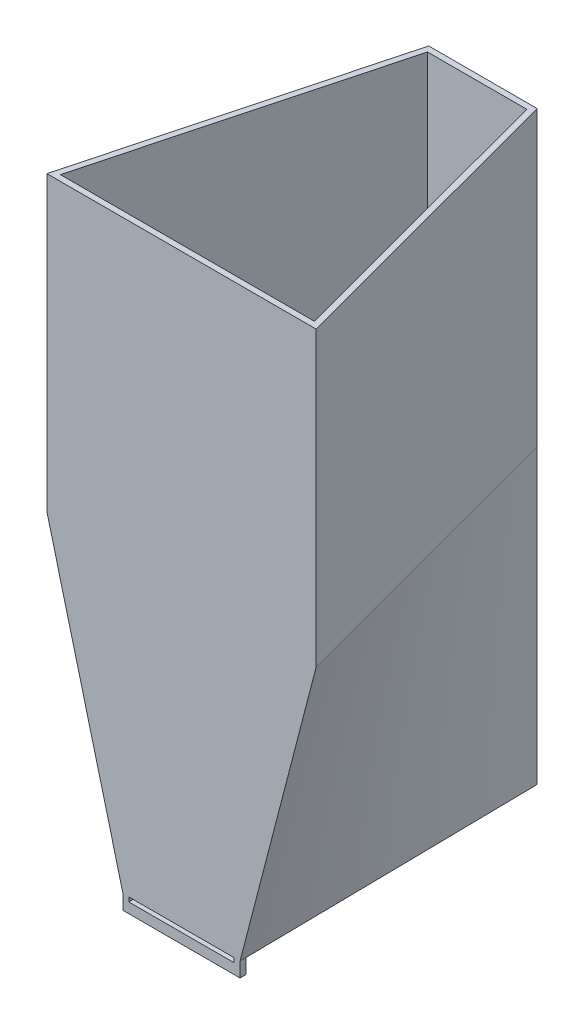
ISO-10303-21;
HEADER;
FILE_DESCRIPTION(('STEP AP214'),'2;1');
FILE_NAME('part.step','',(''),(''),'','','');
FILE_SCHEMA(('AUTOMOTIVE_DESIGN { 1 0 10303 214 1 1 1 1 }'));
ENDSEC;
DATA;
#1=APPLICATION_CONTEXT('core data for automotive mechanical design processes');
#2=APPLICATION_PROTOCOL_DEFINITION('international standard','automotive_design',2000,#1);
#3=PRODUCT_CONTEXT('',#1,'mechanical');
#4=PRODUCT('Part','Part','',(#3));
#5=PRODUCT_RELATED_PRODUCT_CATEGORY('part','',(#4));
#6=PRODUCT_DEFINITION_FORMATION('','',#4);
#7=PRODUCT_DEFINITION_CONTEXT('part definition',#1,'design');
#8=PRODUCT_DEFINITION('design','',#6,#7);
#9=PRODUCT_DEFINITION_SHAPE('','',#8);
#10=(LENGTH_UNIT() NAMED_UNIT(*) SI_UNIT(.MILLI.,.METRE.));
#11=(NAMED_UNIT(*) PLANE_ANGLE_UNIT() SI_UNIT($,.RADIAN.));
#12=(NAMED_UNIT(*) SI_UNIT($,.STERADIAN.) SOLID_ANGLE_UNIT());
#13=UNCERTAINTY_MEASURE_WITH_UNIT(LENGTH_MEASURE(1.E-05),#10,'distance_accuracy_value','');
#14=(GEOMETRIC_REPRESENTATION_CONTEXT(3) GLOBAL_UNCERTAINTY_ASSIGNED_CONTEXT((#13)) GLOBAL_UNIT_ASSIGNED_CONTEXT((#10,
#11,#12)) REPRESENTATION_CONTEXT('',''));
#15=CARTESIAN_POINT('',(0.,0.,0.));
#16=DIRECTION('',(0.,0.,1.));
#17=DIRECTION('',(1.,0.,0.));
#18=AXIS2_PLACEMENT_3D('',#15,#16,#17);
#19=CARTESIAN_POINT('',(20.,2.,0.));
#20=DIRECTION('',(0.,-1.,0.));
#21=DIRECTION('',(-1.,0.,0.));
#22=AXIS2_PLACEMENT_3D('',#19,#20,#21);
#23=PLANE('',#22);
#24=DIRECTION('',(1.,0.,0.));
#25=VECTOR('',#24,1.);
#26=CARTESIAN_POINT('',(20.,1.99999999999999,-101.));
#27=LINE('',#26,#25);
#28=CARTESIAN_POINT('',(15.,2.00000000000003,-101.));
#29=VERTEX_POINT('',#28);
#30=CARTESIAN_POINT('',(16.5388142272661,1.99999999999999,-101.));
#31=VERTEX_POINT('',#30);
#32=EDGE_CURVE('E368',#29,#31,#27,.T.);
#33=ORIENTED_EDGE('',*,*,#32,.F.);
#34=DIRECTION('',(0.,0.,-1.));
#35=VECTOR('',#34,1.);
#36=CARTESIAN_POINT('',(15.,2.,-101.));
#37=LINE('',#36,#35);
#38=CARTESIAN_POINT('',(15.0000000000003,2.,-2.));
#39=VERTEX_POINT('',#38);
#40=EDGE_CURVE('E340',#39,#29,#37,.T.);
#41=ORIENTED_EDGE('',*,*,#40,.F.);
#42=DIRECTION('',(1.,0.,0.));
#43=VECTOR('',#42,1.);
#44=CARTESIAN_POINT('',(20.,2.,-2.));
#45=LINE('',#44,#43);
#46=CARTESIAN_POINT('',(18.4164729310628,1.99999999999999,-2.));
#47=VERTEX_POINT('',#46);
#48=EDGE_CURVE('E817',#39,#47,#45,.T.);
#49=ORIENTED_EDGE('',*,*,#48,.T.);
#50=CARTESIAN_POINT('',(18.4164729310628,1.99999999999999,-2.));
#51=CARTESIAN_POINT('',(18.2575823239799,1.99999999999999,-10.6523175322754));
#52=CARTESIAN_POINT('',(18.0973738520668,1.99999999999999,-19.3046108792494));
#53=CARTESIAN_POINT('',(17.7742456368601,1.99999999999999,-36.6091469494883));
#54=CARTESIAN_POINT('',(17.6113258935641,2.,-45.2613896727531));
#55=CARTESIAN_POINT('',(17.1489404551873,2.00000000000001,-69.609159911635));
#56=CARTESIAN_POINT('',(16.8462827756024,2.00000000000001,-85.3046268446317));
#57=CARTESIAN_POINT('',(16.5388142272661,1.99999999999999,-101.));
#58=B_SPLINE_CURVE_WITH_KNOTS('',3,(#50,#51,#52,#53,#54,#55,#56,#57),.UNSPECIFIED.,.F.,.F.,(4,2,
2,4),(0.,25.9613289311039,51.9226578859185,99.0178097511043),.UNSPECIFIED.);
#59=EDGE_CURVE('E442',#47,#31,#58,.T.);
#60=ORIENTED_EDGE('',*,*,#59,.T.);
#61=EDGE_LOOP('',(#33,#41,#49,#60));
#62=FACE_BOUND('',#61,.T.);
#63=ADVANCED_FACE('F115',(#62),#23,.F.);
#64=CARTESIAN_POINT('',(-46.,200.,0.));
#65=DIRECTION('',(0.,1.,0.));
#66=DIRECTION('',(1.,0.,0.));
#67=AXIS2_PLACEMENT_3D('',#64,#65,#66);
#68=PLANE('',#67);
#69=DIRECTION('',(-1.,0.,0.));
#70=VECTOR('',#69,1.);
#71=CARTESIAN_POINT('',(-46.,200.,0.));
#72=LINE('',#71,#70);
#73=CARTESIAN_POINT('',(46.,200.,0.));
#74=VERTEX_POINT('',#73);
#75=CARTESIAN_POINT('',(-46.,200.,0.));
#76=VERTEX_POINT('',#75);
#77=EDGE_CURVE('E663',#74,#76,#72,.T.);
#78=ORIENTED_EDGE('',*,*,#77,.F.);
#79=CARTESIAN_POINT('',(46.,200.,0.));
#80=CARTESIAN_POINT('',(36.8333333333333,200.,-34.3333333333333));
#81=CARTESIAN_POINT('',(27.6666666666667,200.,-68.6666666666667));
#82=CARTESIAN_POINT('',(18.5,200.,-103.));
#83=B_SPLINE_CURVE_WITH_KNOTS('',3,(#79,#80,#81,#82),.UNSPECIFIED.,.F.,.F.,(4,4),(0.,1.),.UNSPECIFIED.);
#84=CARTESIAN_POINT('',(18.5,200.,-103.));
#85=VERTEX_POINT('',#84);
#86=EDGE_CURVE('E567',#74,#85,#83,.T.);
#87=ORIENTED_EDGE('',*,*,#86,.T.);
#88=DIRECTION('',(-1.,0.,0.));
#89=VECTOR('',#88,1.);
#90=CARTESIAN_POINT('',(-18.5,200.,-103.));
#91=LINE('',#90,#89);
#92=CARTESIAN_POINT('',(-18.5,200.,-103.));
#93=VERTEX_POINT('',#92);
#94=EDGE_CURVE('E590',#85,#93,#91,.T.);
#95=ORIENTED_EDGE('',*,*,#94,.T.);
#96=CARTESIAN_POINT('',(-46.,200.,0.));
#97=CARTESIAN_POINT('',(-36.8333333333333,200.,-34.3333333333333));
#98=CARTESIAN_POINT('',(-27.6666666666667,200.,-68.6666666666667));
#99=CARTESIAN_POINT('',(-18.5,200.,-103.));
#100=B_SPLINE_CURVE_WITH_KNOTS('',3,(#96,#97,#98,#99),.UNSPECIFIED.,.F.,.F.,(4,4),(0.,1.),.UNSPECIFIED.);
#101=EDGE_CURVE('E731',#76,#93,#100,.T.);
#102=ORIENTED_EDGE('',*,*,#101,.F.);
#103=EDGE_LOOP('',(#78,#87,#95,#102));
#104=FACE_BOUND('',#103,.T.);
#105=DIRECTION('',(-0.257954552667178,0.,-0.966157051807974));
#106=VECTOR('',#105,1.);
#107=CARTESIAN_POINT('',(37.9459551821455,200.,-22.4127550243592));
#108=LINE('',#107,#106);
#109=CARTESIAN_POINT('',(43.3959625915618,200.,-2.));
#110=VERTEX_POINT('',#109);
#111=CARTESIAN_POINT('',(16.9639237566103,200.,-101.));
#112=VERTEX_POINT('',#111);
#113=EDGE_CURVE('E413',#110,#112,#108,.T.);
#114=ORIENTED_EDGE('',*,*,#113,.F.);
#115=DIRECTION('',(-1.,0.,0.));
#116=VECTOR('',#115,1.);
#117=CARTESIAN_POINT('',(-46.,200.,-2.));
#118=LINE('',#117,#116);
#119=CARTESIAN_POINT('',(-43.3959625915618,200.,-2.));
#120=VERTEX_POINT('',#119);
#121=EDGE_CURVE('E405',#110,#120,#118,.T.);
#122=ORIENTED_EDGE('',*,*,#121,.T.);
#123=DIRECTION('',(0.257954552667178,0.,-0.966157051807974));
#124=VECTOR('',#123,1.);
#125=CARTESIAN_POINT('',(-44.0676858963841,200.,0.515909105334359));
#126=LINE('',#125,#124);
#127=CARTESIAN_POINT('',(-16.9639237566103,200.,-101.));
#128=VERTEX_POINT('',#127);
#129=EDGE_CURVE('E450',#120,#128,#126,.T.);
#130=ORIENTED_EDGE('',*,*,#129,.T.);
#131=DIRECTION('',(-1.,0.,0.));
#132=VECTOR('',#131,1.);
#133=CARTESIAN_POINT('',(-46.,200.,-101.));
#134=LINE('',#133,#132);
#135=EDGE_CURVE('E721',#112,#128,#134,.T.);
#136=ORIENTED_EDGE('',*,*,#135,.F.);
#137=EDGE_LOOP('',(#114,#122,#130,#136));
#138=FACE_BOUND('',#137,.T.);
#139=ADVANCED_FACE('F648',(#104,#138),#68,.T.);
#140=CARTESIAN_POINT('',(0.,0.,-103.));
#141=DIRECTION('',(0.,0.,-1.));
#142=DIRECTION('',(-1.,0.,0.));
#143=AXIS2_PLACEMENT_3D('',#140,#141,#142);
#144=PLANE('',#143);
#145=DIRECTION('',(1.,0.,0.));
#146=VECTOR('',#145,1.);
#147=CARTESIAN_POINT('',(18.5,0.,-103.));
#148=LINE('',#147,#146);
#149=CARTESIAN_POINT('',(-18.5,0.,-103.));
#150=VERTEX_POINT('',#149);
#151=CARTESIAN_POINT('',(18.5,0.,-103.));
#152=VERTEX_POINT('',#151);
#153=EDGE_CURVE('E545',#150,#152,#148,.T.);
#154=ORIENTED_EDGE('',*,*,#153,.F.);
#155=DIRECTION('',(0.,-1.,0.));
#156=VECTOR('',#155,1.);
#157=CARTESIAN_POINT('',(-18.5,0.,-103.));
#158=LINE('',#157,#156);
#159=CARTESIAN_POINT('',(-18.5,101.635182700712,-103.));
#160=VERTEX_POINT('',#159);
#161=EDGE_CURVE('E562',#160,#150,#158,.T.);
#162=ORIENTED_EDGE('',*,*,#161,.F.);
#163=EDGE_CURVE('E565',#93,#160,#158,.T.);
#164=ORIENTED_EDGE('',*,*,#163,.F.);
#165=ORIENTED_EDGE('',*,*,#94,.F.);
#166=DIRECTION('',(0.,1.,0.));
#167=VECTOR('',#166,1.);
#168=CARTESIAN_POINT('',(18.5,200.,-103.));
#169=LINE('',#168,#167);
#170=CARTESIAN_POINT('',(18.5,100.,-103.));
#171=VERTEX_POINT('',#170);
#172=EDGE_CURVE('E126',#171,#85,#169,.T.);
#173=ORIENTED_EDGE('',*,*,#172,.F.);
#174=EDGE_CURVE('E13',#152,#171,#169,.T.);
#175=ORIENTED_EDGE('',*,*,#174,.F.);
#176=EDGE_LOOP('',(#154,#162,#164,#165,#173,#175));
#177=FACE_BOUND('',#176,.T.);
#178=ADVANCED_FACE('F474',(#177),#144,.T.);
#179=CARTESIAN_POINT('',(0.,0.,0.));
#180=DIRECTION('',(0.,0.,-1.));
#181=DIRECTION('',(-1.,0.,0.));
#182=AXIS2_PLACEMENT_3D('',#179,#180,#181);
#183=PLANE('',#182);
#184=DIRECTION('',(0.,1.,0.));
#185=VECTOR('',#184,1.);
#186=CARTESIAN_POINT('',(-18.,0.,0.));
#187=LINE('',#186,#185);
#188=CARTESIAN_POINT('',(-18.,-1.5,0.));
#189=VERTEX_POINT('',#188);
#190=CARTESIAN_POINT('',(-18.,0.,0.));
#191=VERTEX_POINT('',#190);
#192=EDGE_CURVE('E134',#189,#191,#187,.T.);
#193=ORIENTED_EDGE('',*,*,#192,.T.);
#194=DIRECTION('',(1.,0.,0.));
#195=VECTOR('',#194,1.);
#196=CARTESIAN_POINT('',(20.,0.,0.));
#197=LINE('',#196,#195);
#198=CARTESIAN_POINT('',(18.,0.,0.));
#199=VERTEX_POINT('',#198);
#200=EDGE_CURVE('E518',#191,#199,#197,.T.);
#201=ORIENTED_EDGE('',*,*,#200,.T.);
#202=DIRECTION('',(0.,-1.,0.));
#203=VECTOR('',#202,1.);
#204=CARTESIAN_POINT('',(18.,-1.5,0.));
#205=LINE('',#204,#203);
#206=CARTESIAN_POINT('',(18.,-1.5,0.));
#207=VERTEX_POINT('',#206);
#208=EDGE_CURVE('E329',#199,#207,#205,.T.);
#209=ORIENTED_EDGE('',*,*,#208,.T.);
#210=DIRECTION('',(-1.,0.,0.));
#211=VECTOR('',#210,1.);
#212=CARTESIAN_POINT('',(-18.,-1.5,0.));
#213=LINE('',#212,#211);
#214=EDGE_CURVE('E308',#207,#189,#213,.T.);
#215=ORIENTED_EDGE('',*,*,#214,.T.);
#216=EDGE_LOOP('',(#193,#201,#209,#215));
#217=FACE_BOUND('',#216,.T.);
#218=DIRECTION('',(0.251633851764951,-0.967822506788272,0.));
#219=VECTOR('',#218,1.);
#220=CARTESIAN_POINT('',(-46.,100.,0.));
#221=LINE('',#220,#219);
#222=CARTESIAN_POINT('',(-46.,100.,0.));
#223=VERTEX_POINT('',#222);
#224=CARTESIAN_POINT('',(-20.,0.,0.));
#225=VERTEX_POINT('',#224);
#226=EDGE_CURVE('E120',#223,#225,#221,.T.);
#227=ORIENTED_EDGE('',*,*,#226,.T.);
#228=DIRECTION('',(0.,-1.,0.));
#229=VECTOR('',#228,1.);
#230=CARTESIAN_POINT('',(-20.,-5.00000000000001,0.));
#231=LINE('',#230,#229);
#232=CARTESIAN_POINT('',(-20.,-5.00000000000001,0.));
#233=VERTEX_POINT('',#232);
#234=EDGE_CURVE('E327',#225,#233,#231,.T.);
#235=ORIENTED_EDGE('',*,*,#234,.T.);
#236=DIRECTION('',(1.,0.,0.));
#237=VECTOR('',#236,1.);
#238=CARTESIAN_POINT('',(20.,-5.,0.));
#239=LINE('',#238,#237);
#240=CARTESIAN_POINT('',(20.,-5.,0.));
#241=VERTEX_POINT('',#240);
#242=EDGE_CURVE('E287',#233,#241,#239,.T.);
#243=ORIENTED_EDGE('',*,*,#242,.T.);
#244=DIRECTION('',(0.,1.,0.));
#245=VECTOR('',#244,1.);
#246=CARTESIAN_POINT('',(20.,0.,0.));
#247=LINE('',#246,#245);
#248=CARTESIAN_POINT('',(20.,0.,0.));
#249=VERTEX_POINT('',#248);
#250=EDGE_CURVE('E326',#241,#249,#247,.T.);
#251=ORIENTED_EDGE('',*,*,#250,.T.);
#252=DIRECTION('',(0.251633851764951,0.967822506788272,0.));
#253=VECTOR('',#252,1.);
#254=CARTESIAN_POINT('',(46.,100.,0.));
#255=LINE('',#254,#253);
#256=CARTESIAN_POINT('',(46.,100.,0.));
#257=VERTEX_POINT('',#256);
#258=EDGE_CURVE('E767',#249,#257,#255,.T.);
#259=ORIENTED_EDGE('',*,*,#258,.T.);
#260=DIRECTION('',(0.,1.,0.));
#261=VECTOR('',#260,1.);
#262=CARTESIAN_POINT('',(46.,200.,0.));
#263=LINE('',#262,#261);
#264=EDGE_CURVE('E633',#257,#74,#263,.T.);
#265=ORIENTED_EDGE('',*,*,#264,.T.);
#266=ORIENTED_EDGE('',*,*,#77,.T.);
#267=DIRECTION('',(0.,-1.,0.));
#268=VECTOR('',#267,1.);
#269=CARTESIAN_POINT('',(-46.,200.,0.));
#270=LINE('',#269,#268);
#271=EDGE_CURVE('E686',#76,#223,#270,.T.);
#272=ORIENTED_EDGE('',*,*,#271,.T.);
#273=EDGE_LOOP('',(#227,#235,#243,#251,#259,#265,#266,#272));
#274=FACE_BOUND('',#273,.T.);
#275=ADVANCED_FACE('F468',(#217,#274),#183,.F.);
#276=CARTESIAN_POINT('',(46.,200.,0.));
#277=DIRECTION('',(0.966157051807974,0.,-0.257954552667178));
#278=DIRECTION('',(0.,-1.,0.));
#279=AXIS2_PLACEMENT_3D('',#276,#277,#278);
#280=PLANE('',#279);
#281=ORIENTED_EDGE('',*,*,#264,.F.);
#282=CARTESIAN_POINT('',(46.,100.,0.));
#283=CARTESIAN_POINT('',(36.8333333333333,100.,-34.3333333333333));
#284=CARTESIAN_POINT('',(27.6666666666667,100.,-68.6666666666667));
#285=CARTESIAN_POINT('',(18.5,100.,-103.));
#286=B_SPLINE_CURVE_WITH_KNOTS('',3,(#282,#283,#284,#285),.UNSPECIFIED.,.F.,.F.,(4,4),(0.,1.),.UNSPECIFIED.);
#287=EDGE_CURVE('E563',#257,#171,#286,.T.);
#288=ORIENTED_EDGE('',*,*,#287,.T.);
#289=ORIENTED_EDGE('',*,*,#172,.T.);
#290=ORIENTED_EDGE('',*,*,#86,.F.);
#291=EDGE_LOOP('',(#281,#288,#289,#290));
#292=FACE_BOUND('',#291,.T.);
#293=ADVANCED_FACE('F473',(#292),#280,.T.);
#294=CARTESIAN_POINT('',(-46.,100.,0.));
#295=DIRECTION('',(-0.966157051807974,0.,-0.257954552667178));
#296=DIRECTION('',(0.,1.,0.));
#297=AXIS2_PLACEMENT_3D('',#294,#295,#296);
#298=PLANE('',#297);
#299=ORIENTED_EDGE('',*,*,#271,.F.);
#300=ORIENTED_EDGE('',*,*,#101,.T.);
#301=ORIENTED_EDGE('',*,*,#163,.T.);
#302=CARTESIAN_POINT('',(-46.,100.,0.));
#303=CARTESIAN_POINT('',(-36.8333333333333,100.545060900238,-34.3333333333333));
#304=CARTESIAN_POINT('',(-27.6666666666667,101.090121800475,-68.6666666666667));
#305=CARTESIAN_POINT('',(-18.5,101.635182700712,-103.));
#306=B_SPLINE_CURVE_WITH_KNOTS('',3,(#302,#303,#304,#305),.UNSPECIFIED.,.F.,.F.,(4,4),(0.,1.),.UNSPECIFIED.);
#307=EDGE_CURVE('E728',#223,#160,#306,.T.);
#308=ORIENTED_EDGE('',*,*,#307,.F.);
#309=EDGE_LOOP('',(#299,#300,#301,#308));
#310=FACE_BOUND('',#309,.T.);
#311=ADVANCED_FACE('F647',(#310),#298,.T.);
#312=CARTESIAN_POINT('',(-20.,0.,0.));
#313=CARTESIAN_POINT('',(-19.5,0.,-34.3333333333333));
#314=CARTESIAN_POINT('',(-19.,0.,-68.6666666666667));
#315=CARTESIAN_POINT('',(-18.5,0.,-103.));
#316=CARTESIAN_POINT('',(-22.1666666666667,8.33333333333339,0.));
#317=CARTESIAN_POINT('',(-20.9444444444445,8.37875507501982,-34.3333333333333));
#318=CARTESIAN_POINT('',(-19.7222222222222,8.42417681670626,-68.6666666666667));
#319=CARTESIAN_POINT('',(-18.5,8.4695985583927,-103.));
#320=CARTESIAN_POINT('',(-26.5,25.0000000000001,0.));
#321=CARTESIAN_POINT('',(-23.8333333333333,25.1362652250594,-34.3333333333333));
#322=CARTESIAN_POINT('',(-21.1666666666667,25.2725304501188,-68.6666666666667));
#323=CARTESIAN_POINT('',(-18.5,25.4087956751781,-103.));
#324=CARTESIAN_POINT('',(-33.,50.,0.));
#325=CARTESIAN_POINT('',(-28.1666666666667,50.2725304501187,-34.3333333333333));
#326=CARTESIAN_POINT('',(-23.3333333333333,50.5450609002375,-68.6666666666666));
#327=CARTESIAN_POINT('',(-18.5,50.8175913503562,-103.));
#328=CARTESIAN_POINT('',(-39.5,75.0000000000001,0.));
#329=CARTESIAN_POINT('',(-32.5,75.4087956751782,-34.3333333333333));
#330=CARTESIAN_POINT('',(-25.5,75.8175913503563,-68.6666666666667));
#331=CARTESIAN_POINT('',(-18.5,76.2263870255344,-103.));
#332=CARTESIAN_POINT('',(-43.8333333333333,91.6666666666667,0.));
#333=CARTESIAN_POINT('',(-35.3888888888889,92.1663058252177,-34.3333333333333));
#334=CARTESIAN_POINT('',(-26.9444444444444,92.6659449837687,-68.6666666666667));
#335=CARTESIAN_POINT('',(-18.5,93.1655841423198,-103.));
#336=CARTESIAN_POINT('',(-46.,100.,0.));
#337=CARTESIAN_POINT('',(-36.8333333333333,100.545060900238,-34.3333333333333));
#338=CARTESIAN_POINT('',(-27.6666666666667,101.090121800475,-68.6666666666667));
#339=CARTESIAN_POINT('',(-18.5,101.635182700712,-103.));
#340=B_SPLINE_SURFACE_WITH_KNOTS('',3,3,((#312,#313,#314,#315),(#316,#317,#318,#319),(#320,#321,
#322,#323),(#324,#325,#326,#327),(#328,#329,#330,#331),(#332,#333,#334,#335),(#336,#337,#338,
#339)),.UNSPECIFIED.,.F.,.F.,.F.,(4,1,1,1,4),(4,4),(0.27755558671084,0.328335843788818,
0.379116100866795,0.429896357944773,0.480676615022751),(0.,1.),.UNSPECIFIED.);
#341=CARTESIAN_POINT('',(-20.,0.,0.));
#342=CARTESIAN_POINT('',(-19.5,0.,-34.3333333333333));
#343=CARTESIAN_POINT('',(-19.,0.,-68.6666666666667));
#344=CARTESIAN_POINT('',(-18.5,0.,-103.));
#345=B_SPLINE_CURVE_WITH_KNOTS('',3,(#341,#342,#343,#344),.UNSPECIFIED.,.F.,.F.,(4,4),(0.,1.),.UNSPECIFIED.);
#346=CARTESIAN_POINT('',(-19.9708737864078,0.,-2.));
#347=VERTEX_POINT('',#346);
#348=EDGE_CURVE('E527',#347,#150,#345,.T.);
#349=EDGE_CURVE('E732',#225,#347,#345,.T.);
#350=ORIENTED_EDGE('',*,*,#226,.F.);
#351=ORIENTED_EDGE('',*,*,#307,.T.);
#352=ORIENTED_EDGE('',*,*,#161,.T.);
#353=ORIENTED_EDGE('',*,*,#348,.F.);
#354=ORIENTED_EDGE('',*,*,#349,.F.);
#355=EDGE_LOOP('',(#350,#351,#352,#353,#354));
#356=FACE_BOUND('',#355,.T.);
#357=ADVANCED_FACE('F696',(#356),#340,.T.);
#358=CARTESIAN_POINT('',(20.,0.,0.));
#359=DIRECTION('',(0.,-1.,0.));
#360=DIRECTION('',(-1.,0.,0.));
#361=AXIS2_PLACEMENT_3D('',#358,#359,#360);
#362=PLANE('',#361);
#363=DIRECTION('',(0.,0.,1.));
#364=VECTOR('',#363,1.);
#365=CARTESIAN_POINT('',(-18.,0.,-2.));
#366=LINE('',#365,#364);
#367=CARTESIAN_POINT('',(-18.,0.,-2.));
#368=VERTEX_POINT('',#367);
#369=EDGE_CURVE('E332',#368,#191,#366,.T.);
#370=ORIENTED_EDGE('',*,*,#369,.F.);
#371=DIRECTION('',(-1.,0.,0.));
#372=VECTOR('',#371,1.);
#373=CARTESIAN_POINT('',(-20.,0.,-2.));
#374=LINE('',#373,#372);
#375=EDGE_CURVE('E293',#368,#347,#374,.T.);
#376=ORIENTED_EDGE('',*,*,#375,.T.);
#377=ORIENTED_EDGE('',*,*,#348,.T.);
#378=ORIENTED_EDGE('',*,*,#153,.T.);
#379=CARTESIAN_POINT('',(20.,0.,0.));
#380=CARTESIAN_POINT('',(19.5,0.,-34.3333333333333));
#381=CARTESIAN_POINT('',(19.,0.,-68.6666666666667));
#382=CARTESIAN_POINT('',(18.5,0.,-103.));
#383=B_SPLINE_CURVE_WITH_KNOTS('',3,(#379,#380,#381,#382),.UNSPECIFIED.,.F.,.F.,(4,4),(0.,1.),.UNSPECIFIED.);
#384=CARTESIAN_POINT('',(19.9708737864078,0.,-2.00000000000001));
#385=VERTEX_POINT('',#384);
#386=EDGE_CURVE('E519',#385,#152,#383,.T.);
#387=ORIENTED_EDGE('',*,*,#386,.F.);
#388=DIRECTION('',(-1.,0.,0.));
#389=VECTOR('',#388,1.);
#390=CARTESIAN_POINT('',(18.,0.,-2.));
#391=LINE('',#390,#389);
#392=CARTESIAN_POINT('',(18.,0.,-2.));
#393=VERTEX_POINT('',#392);
#394=EDGE_CURVE('E312',#385,#393,#391,.T.);
#395=ORIENTED_EDGE('',*,*,#394,.T.);
#396=DIRECTION('',(0.,0.,1.));
#397=VECTOR('',#396,1.);
#398=CARTESIAN_POINT('',(18.,0.,-2.));
#399=LINE('',#398,#397);
#400=EDGE_CURVE('E335',#393,#199,#399,.T.);
#401=ORIENTED_EDGE('',*,*,#400,.T.);
#402=ORIENTED_EDGE('',*,*,#200,.F.);
#403=EDGE_LOOP('',(#370,#376,#377,#378,#387,#395,#401,#402));
#404=FACE_BOUND('',#403,.T.);
#405=DIRECTION('',(0.,0.,1.));
#406=VECTOR('',#405,1.);
#407=CARTESIAN_POINT('',(15.,0.,-101.));
#408=LINE('',#407,#406);
#409=CARTESIAN_POINT('',(15.,0.,-101.));
#410=VERTEX_POINT('',#409);
#411=CARTESIAN_POINT('',(15.,0.,-2.));
#412=VERTEX_POINT('',#411);
#413=EDGE_CURVE('E343',#410,#412,#408,.T.);
#414=ORIENTED_EDGE('',*,*,#413,.F.);
#415=DIRECTION('',(1.,0.,0.));
#416=VECTOR('',#415,1.);
#417=CARTESIAN_POINT('',(-15.,0.,-101.));
#418=LINE('',#417,#416);
#419=CARTESIAN_POINT('',(-15.,0.,-101.));
#420=VERTEX_POINT('',#419);
#421=EDGE_CURVE('E351',#420,#410,#418,.T.);
#422=ORIENTED_EDGE('',*,*,#421,.F.);
#423=DIRECTION('',(0.,0.,-1.));
#424=VECTOR('',#423,1.);
#425=CARTESIAN_POINT('',(-15.,0.,-101.));
#426=LINE('',#425,#424);
#427=CARTESIAN_POINT('',(-15.,0.,-2.));
#428=VERTEX_POINT('',#427);
#429=EDGE_CURVE('E348',#428,#420,#426,.T.);
#430=ORIENTED_EDGE('',*,*,#429,.F.);
#431=DIRECTION('',(-1.,0.,0.));
#432=VECTOR('',#431,1.);
#433=CARTESIAN_POINT('',(-15.,0.,-2.));
#434=LINE('',#433,#432);
#435=EDGE_CURVE('E345',#412,#428,#434,.T.);
#436=ORIENTED_EDGE('',*,*,#435,.F.);
#437=EDGE_LOOP('',(#414,#422,#430,#436));
#438=FACE_BOUND('',#437,.T.);
#439=ADVANCED_FACE('F117',(#404,#438),#362,.T.);
#440=CARTESIAN_POINT('',(46.,100.,0.));
#441=CARTESIAN_POINT('',(36.8333333333333,100.,-34.3333333333333));
#442=CARTESIAN_POINT('',(27.6666666666667,100.,-68.6666666666667));
#443=CARTESIAN_POINT('',(18.5,100.,-103.));
#444=CARTESIAN_POINT('',(43.8333333333333,91.6666666666667,0.));
#445=CARTESIAN_POINT('',(35.3888888888889,91.6666666666666,-34.3333333333333));
#446=CARTESIAN_POINT('',(26.9444444444444,91.6666666666666,-68.6666666666667));
#447=CARTESIAN_POINT('',(18.5,91.6666666666666,-103.));
#448=CARTESIAN_POINT('',(39.5,75.0000000000001,0.));
#449=CARTESIAN_POINT('',(32.5,75.0000000000001,-34.3333333333333));
#450=CARTESIAN_POINT('',(25.5,75.0000000000001,-68.6666666666667));
#451=CARTESIAN_POINT('',(18.5,75.0000000000001,-103.));
#452=CARTESIAN_POINT('',(33.,50.,0.));
#453=CARTESIAN_POINT('',(28.1666666666667,50.,-34.3333333333334));
#454=CARTESIAN_POINT('',(23.3333333333334,50.,-68.6666666666667));
#455=CARTESIAN_POINT('',(18.5,50.,-103.));
#456=CARTESIAN_POINT('',(26.5,25.0000000000001,0.));
#457=CARTESIAN_POINT('',(23.8333333333333,25.,-34.3333333333333));
#458=CARTESIAN_POINT('',(21.1666666666667,25.,-68.6666666666667));
#459=CARTESIAN_POINT('',(18.5,25.,-103.));
#460=CARTESIAN_POINT('',(22.1666666666667,8.33333333333338,0.));
#461=CARTESIAN_POINT('',(20.9444444444444,8.33333333333337,-34.3333333333333));
#462=CARTESIAN_POINT('',(19.7222222222222,8.33333333333335,-68.6666666666667));
#463=CARTESIAN_POINT('',(18.5,8.33333333333333,-103.));
#464=CARTESIAN_POINT('',(20.,0.,0.));
#465=CARTESIAN_POINT('',(19.5,0.,-34.3333333333333));
#466=CARTESIAN_POINT('',(19.,0.,-68.6666666666667));
#467=CARTESIAN_POINT('',(18.5,0.,-103.));
#468=B_SPLINE_SURFACE_WITH_KNOTS('',3,3,((#440,#441,#442,#443),(#444,#445,#446,#447),(#448,#449,
#450,#451),(#452,#453,#454,#455),(#456,#457,#458,#459),(#460,#461,#462,#463),(#464,#465,#466,
#467)),.UNSPECIFIED.,.F.,.F.,.F.,(4,1,1,1,4),(4,4),(0.,0.0503490380113343,0.100698076022669,
0.151047114034003,0.201396152045337),(0.,1.),.UNSPECIFIED.);
#469=EDGE_CURVE('E771',#249,#385,#383,.T.);
#470=ORIENTED_EDGE('',*,*,#258,.F.);
#471=ORIENTED_EDGE('',*,*,#469,.T.);
#472=ORIENTED_EDGE('',*,*,#386,.T.);
#473=ORIENTED_EDGE('',*,*,#174,.T.);
#474=ORIENTED_EDGE('',*,*,#287,.F.);
#475=EDGE_LOOP('',(#470,#471,#472,#473,#474));
#476=FACE_BOUND('',#475,.T.);
#477=ADVANCED_FACE('F386',(#476),#468,.T.);
#478=CARTESIAN_POINT('',(0.,0.,-101.));
#479=DIRECTION('',(0.,0.,-1.));
#480=DIRECTION('',(-1.,0.,0.));
#481=AXIS2_PLACEMENT_3D('',#478,#479,#480);
#482=PLANE('',#481);
#483=CARTESIAN_POINT('',(-16.5386587044467,2.00000000000006,-101.));
#484=VERTEX_POINT('',#483);
#485=CARTESIAN_POINT('',(-15.,2.00000000000006,-101.));
#486=VERTEX_POINT('',#485);
#487=EDGE_CURVE('E364',#484,#486,#27,.T.);
#488=ORIENTED_EDGE('',*,*,#487,.T.);
#489=DIRECTION('',(0.,-1.,0.));
#490=VECTOR('',#489,1.);
#491=CARTESIAN_POINT('',(-14.9999999999997,200.0011,-101.));
#492=LINE('',#491,#490);
#493=EDGE_CURVE('E358',#486,#420,#492,.T.);
#494=ORIENTED_EDGE('',*,*,#493,.T.);
#495=ORIENTED_EDGE('',*,*,#421,.T.);
#496=DIRECTION('',(0.,-1.,0.));
#497=VECTOR('',#496,1.);
#498=CARTESIAN_POINT('',(15.0000000000003,200.0011,-101.));
#499=LINE('',#498,#497);
#500=EDGE_CURVE('E355',#29,#410,#499,.T.);
#501=ORIENTED_EDGE('',*,*,#500,.F.);
#502=ORIENTED_EDGE('',*,*,#32,.T.);
#503=CARTESIAN_POINT('',(16.5388142272661,1.99999999999999,-101.));
#504=CARTESIAN_POINT('',(16.5816576441167,10.653670347363,-101.));
#505=CARTESIAN_POINT('',(16.6230516240702,19.3073478105019,-101.));
#506=CARTESIAN_POINT('',(16.7030103061143,36.6147158082582,-101.));
#507=CARTESIAN_POINT('',(16.7415750082059,45.2684063428755,-101.));
#508=CARTESIAN_POINT('',(16.8447637566166,69.2825906877579,-101.));
#509=CARTESIAN_POINT('',(16.9064201825429,84.6430973141544,-101.));
#510=CARTESIAN_POINT('',(16.9639237566103,100.003619481238,-101.));
#511=B_SPLINE_CURVE_WITH_KNOTS('',3,(#503,#504,#505,#506,#507,#508,#509,#510),.UNSPECIFIED.,.F.,
.F.,(4,2,2,4),(0.,25.9613289816359,51.9226579532037,98.0045466074217),.UNSPECIFIED.);
#512=CARTESIAN_POINT('',(16.9639237566103,100.003619481239,-101.));
#513=VERTEX_POINT('',#512);
#514=EDGE_CURVE('E394',#31,#513,#511,.T.);
#515=ORIENTED_EDGE('',*,*,#514,.T.);
#516=DIRECTION('',(0.,1.,0.));
#517=VECTOR('',#516,1.);
#518=CARTESIAN_POINT('',(16.9639237566103,200.,-101.));
#519=LINE('',#518,#517);
#520=EDGE_CURVE('E401',#513,#112,#519,.T.);
#521=ORIENTED_EDGE('',*,*,#520,.T.);
#522=ORIENTED_EDGE('',*,*,#135,.T.);
#523=DIRECTION('',(0.,-1.,0.));
#524=VECTOR('',#523,1.);
#525=CARTESIAN_POINT('',(-16.9639237566103,100.,-101.));
#526=LINE('',#525,#524);
#527=CARTESIAN_POINT('',(-16.9639237566103,101.61518453251,-101.));
#528=VERTEX_POINT('',#527);
#529=EDGE_CURVE('E376',#128,#528,#526,.T.);
#530=ORIENTED_EDGE('',*,*,#529,.T.);
#531=CARTESIAN_POINT('',(-16.9639237566103,101.61518453251,-101.));
#532=CARTESIAN_POINT('',(-16.9320309560434,92.9618919353985,-101.));
#533=CARTESIAN_POINT('',(-16.8988727290053,84.3086039848911,-101.));
#534=CARTESIAN_POINT('',(-16.82994682067,67.0020384726978,-101.));
#535=CARTESIAN_POINT('',(-16.7941791393704,58.3487609110117,-101.));
#536=CARTESIAN_POINT('',(-16.688882685037,33.7969721830396,-101.));
#537=CARTESIAN_POINT('',(-16.6161610233921,17.8984746762304,-101.));
#538=CARTESIAN_POINT('',(-16.5386587044467,2.00000000000006,-101.));
#539=B_SPLINE_CURVE_WITH_KNOTS('',3,(#531,#532,#533,#534,#535,#536,#537,#538),.UNSPECIFIED.,.F.,
.F.,(4,2,2,4),(0.,25.9600540365638,51.9201080961063,99.6160972648369),.UNSPECIFIED.);
#540=EDGE_CURVE('E367',#528,#484,#539,.T.);
#541=ORIENTED_EDGE('',*,*,#540,.T.);
#542=EDGE_LOOP('',(#488,#494,#495,#501,#502,#515,#521,#522,#530,#541));
#543=FACE_BOUND('',#542,.T.);
#544=ADVANCED_FACE('F381',(#543),#482,.F.);
#545=CARTESIAN_POINT('',(0.,0.,-2.));
#546=DIRECTION('',(0.,0.,-1.));
#547=DIRECTION('',(-1.,0.,0.));
#548=AXIS2_PLACEMENT_3D('',#545,#546,#547);
#549=PLANE('',#548);
#550=CARTESIAN_POINT('',(-43.3959625915618,100.281180315812,-2.));
#551=CARTESIAN_POINT('',(-41.2690491512727,91.8932885100508,-2.));
#552=CARTESIAN_POINT('',(-39.1409787043565,83.5056900731114,-2.));
#553=CARTESIAN_POINT('',(-34.8824566064713,66.7310977060687,-2.));
#554=CARTESIAN_POINT('',(-32.7520049555004,58.3441037759659,-2.));
#555=CARTESIAN_POINT('',(-26.5568616596554,33.9704628620493,-2.));
#556=CARTESIAN_POINT('',(-22.4889458279281,17.9846353444877,-2.));
#557=CARTESIAN_POINT('',(-18.4163489134658,2.00000000000004,-2.));
#558=B_SPLINE_CURVE_WITH_KNOTS('',3,(#550,#551,#552,#553,#554,#555,#556,#557),.UNSPECIFIED.,.F.,
.F.,(4,2,2,4),(0.,25.9600540055203,51.9201080303221,101.405978343247),.UNSPECIFIED.);
#559=CARTESIAN_POINT('',(-43.3959625915618,100.281180315812,-2.));
#560=VERTEX_POINT('',#559);
#561=CARTESIAN_POINT('',(-18.4163489134658,2.00000000000003,-2.));
#562=VERTEX_POINT('',#561);
#563=EDGE_CURVE('E357',#560,#562,#558,.T.);
#564=ORIENTED_EDGE('',*,*,#563,.F.);
#565=DIRECTION('',(0.,-1.,0.));
#566=VECTOR('',#565,1.);
#567=CARTESIAN_POINT('',(-43.3959625915618,100.,-2.));
#568=LINE('',#567,#566);
#569=EDGE_CURVE('E440',#120,#560,#568,.T.);
#570=ORIENTED_EDGE('',*,*,#569,.F.);
#571=ORIENTED_EDGE('',*,*,#121,.F.);
#572=DIRECTION('',(0.,1.,0.));
#573=VECTOR('',#572,1.);
#574=CARTESIAN_POINT('',(43.3959625915618,200.,-2.));
#575=LINE('',#574,#573);
#576=CARTESIAN_POINT('',(43.3959625915618,100.24152781511,-2.));
#577=VERTEX_POINT('',#576);
#578=EDGE_CURVE('E402',#577,#110,#575,.T.);
#579=ORIENTED_EDGE('',*,*,#578,.F.);
#580=CARTESIAN_POINT('',(18.4164729310628,1.99999999999999,-2.));
#581=CARTESIAN_POINT('',(20.5536784674794,10.3857139106715,-2.));
#582=CARTESIAN_POINT('',(22.6896466149239,18.7717431376734,-2.));
#583=CARTESIAN_POINT('',(26.9591603469497,35.5444182596834,-2.));
#584=CARTESIAN_POINT('',(29.0927059315315,43.9310641546913,-2.));
#585=CARTESIAN_POINT('',(35.286270665825,68.2914398374214,-2.));
#586=CARTESIAN_POINT('',(39.3431759602947,84.2659613845772,-2.));
#587=CARTESIAN_POINT('',(43.3959625915618,100.24152781511,-2.));
#588=B_SPLINE_CURVE_WITH_KNOTS('',3,(#580,#581,#582,#583,#584,#585,#586,#587),.UNSPECIFIED.,.F.,
.F.,(4,2,2,4),(0.,25.9613289034038,51.9226578001649,101.367517399023),.UNSPECIFIED.);
#589=EDGE_CURVE('E406',#47,#577,#588,.T.);
#590=ORIENTED_EDGE('',*,*,#589,.F.);
#591=ORIENTED_EDGE('',*,*,#48,.F.);
#592=DIRECTION('',(0.,-1.,0.));
#593=VECTOR('',#592,1.);
#594=CARTESIAN_POINT('',(15.0000000000003,200.0011,-2.00000000000001));
#595=LINE('',#594,#593);
#596=EDGE_CURVE('E354',#39,#412,#595,.T.);
#597=ORIENTED_EDGE('',*,*,#596,.T.);
#598=ORIENTED_EDGE('',*,*,#435,.T.);
#599=DIRECTION('',(0.,-1.,0.));
#600=VECTOR('',#599,1.);
#601=CARTESIAN_POINT('',(-14.9999999999997,200.0011,-2.00000000000001));
#602=LINE('',#601,#600);
#603=CARTESIAN_POINT('',(-15.,2.00000000000005,-2.));
#604=VERTEX_POINT('',#603);
#605=EDGE_CURVE('E360',#604,#428,#602,.T.);
#606=ORIENTED_EDGE('',*,*,#605,.F.);
#607=EDGE_CURVE('E439',#562,#604,#45,.T.);
#608=ORIENTED_EDGE('',*,*,#607,.F.);
#609=EDGE_LOOP('',(#564,#570,#571,#579,#590,#591,#597,#598,#606,#608));
#610=FACE_BOUND('',#609,.T.);
#611=ADVANCED_FACE('F385',(#610),#549,.T.);
#612=CARTESIAN_POINT('',(44.0676858963841,200.,0.515909105334355));
#613=DIRECTION('',(0.966157051807974,0.,-0.257954552667178));
#614=DIRECTION('',(0.,-1.,0.));
#615=AXIS2_PLACEMENT_3D('',#612,#613,#614);
#616=PLANE('',#615);
#617=ORIENTED_EDGE('',*,*,#578,.T.);
#618=ORIENTED_EDGE('',*,*,#113,.T.);
#619=ORIENTED_EDGE('',*,*,#520,.F.);
#620=CARTESIAN_POINT('',(43.3959625915618,100.24152781511,-2.));
#621=CARTESIAN_POINT('',(41.1932923562864,100.22226711485,-10.2500012448496));
#622=CARTESIAN_POINT('',(38.9906222418031,100.202800574167,-18.500002037278));
#623=CARTESIAN_POINT('',(34.5852822015659,100.163551287973,-35.0000029152572));
#624=CARTESIAN_POINT('',(32.3826122758121,100.143768542462,-43.250003000808));
#625=CARTESIAN_POINT('',(27.9772725502816,100.103982322547,-59.7500027000677));
#626=CARTESIAN_POINT('',(25.7746027505049,100.083978848142,-68.0000023137765));
#627=CARTESIAN_POINT('',(21.369263218528,100.043857940904,-84.5000012880903));
#628=CARTESIAN_POINT('',(19.1665934863277,100.023740508071,-92.7500006486951));
#629=CARTESIAN_POINT('',(16.9639237566103,100.003619481241,-101.));
#630=B_SPLINE_CURVE_WITH_KNOTS('',3,(#620,#621,#622,#623,#624,#625,#626,#627,#628,#629),
.UNSPECIFIED.,.F.,.F.,(4,2,2,2,4),(0.,25.6170222451254,51.2340444737124,76.851066784331,
102.468089111488),.UNSPECIFIED.);
#631=EDGE_CURVE('E407',#577,#513,#630,.T.);
#632=ORIENTED_EDGE('',*,*,#631,.F.);
#633=EDGE_LOOP('',(#617,#618,#619,#632));
#634=FACE_BOUND('',#633,.T.);
#635=ADVANCED_FACE('F420',(#634),#616,.F.);
#636=CARTESIAN_POINT('',(-44.0676858963841,100.,0.515909105334355));
#637=DIRECTION('',(-0.966157051807974,0.,-0.257954552667178));
#638=DIRECTION('',(0.,1.,0.));
#639=AXIS2_PLACEMENT_3D('',#636,#637,#638);
#640=PLANE('',#639);
#641=ORIENTED_EDGE('',*,*,#569,.T.);
#642=CARTESIAN_POINT('',(-43.3959625915618,100.281180315812,-2.));
#643=CARTESIAN_POINT('',(-41.1932936271388,100.392626460712,-10.2499964849296));
#644=CARTESIAN_POINT('',(-38.9906241989235,100.503934653287,-18.4999947069724));
#645=CARTESIAN_POINT('',(-34.5852847572528,100.726376834955,-34.9999933430484));
#646=CARTESIAN_POINT('',(-32.3826147437973,100.837510824049,-43.2499937570815));
#647=CARTESIAN_POINT('',(-27.9772744726038,101.059706299996,-59.7499955000972));
#648=CARTESIAN_POINT('',(-25.7746042148657,101.17076778685,-67.9999968290798));
#649=CARTESIAN_POINT('',(-21.3692638121257,101.392924397333,-84.4999990647971));
#650=CARTESIAN_POINT('',(-19.1665936671237,101.504019520963,-92.7499999715318));
#651=CARTESIAN_POINT('',(-16.9639237566103,101.61518453251,-101.));
#652=B_SPLINE_CURVE_WITH_KNOTS('',3,(#642,#643,#644,#645,#646,#647,#648,#649,#650,#651),
.UNSPECIFIED.,.F.,.F.,(4,2,2,2,4),(0.,25.619124010544,51.2382480193157,76.8573720406759,
102.476496063808),.UNSPECIFIED.);
#653=EDGE_CURVE('E443',#560,#528,#652,.T.);
#654=ORIENTED_EDGE('',*,*,#653,.T.);
#655=ORIENTED_EDGE('',*,*,#529,.F.);
#656=ORIENTED_EDGE('',*,*,#129,.F.);
#657=EDGE_LOOP('',(#641,#654,#655,#656));
#658=FACE_BOUND('',#657,.T.);
#659=ADVANCED_FACE('F423',(#658),#640,.F.);
#660=CARTESIAN_POINT('',(-20.,0.,0.));
#661=CARTESIAN_POINT('',(-19.5,0.,-34.3333333333333));
#662=CARTESIAN_POINT('',(-19.,0.,-68.6666666666667));
#663=CARTESIAN_POINT('',(-18.5,0.,-103.));
#664=CARTESIAN_POINT('',(-22.1666666666667,8.33333333333339,0.));
#665=CARTESIAN_POINT('',(-20.9444444444445,8.37875507501982,-34.3333333333333));
#666=CARTESIAN_POINT('',(-19.7222222222222,8.42417681670626,-68.6666666666667));
#667=CARTESIAN_POINT('',(-18.5,8.4695985583927,-103.));
#668=CARTESIAN_POINT('',(-26.5,25.0000000000001,0.));
#669=CARTESIAN_POINT('',(-23.8333333333333,25.1362652250594,-34.3333333333333));
#670=CARTESIAN_POINT('',(-21.1666666666667,25.2725304501188,-68.6666666666667));
#671=CARTESIAN_POINT('',(-18.5,25.4087956751781,-103.));
#672=CARTESIAN_POINT('',(-33.,50.,0.));
#673=CARTESIAN_POINT('',(-28.1666666666667,50.2725304501187,-34.3333333333333));
#674=CARTESIAN_POINT('',(-23.3333333333333,50.5450609002375,-68.6666666666666));
#675=CARTESIAN_POINT('',(-18.5,50.8175913503562,-103.));
#676=CARTESIAN_POINT('',(-39.5,75.0000000000001,0.));
#677=CARTESIAN_POINT('',(-32.5,75.4087956751782,-34.3333333333333));
#678=CARTESIAN_POINT('',(-25.5,75.8175913503563,-68.6666666666667));
#679=CARTESIAN_POINT('',(-18.5,76.2263870255344,-103.));
#680=CARTESIAN_POINT('',(-43.8333333333333,91.6666666666667,0.));
#681=CARTESIAN_POINT('',(-35.3888888888889,92.1663058252177,-34.3333333333333));
#682=CARTESIAN_POINT('',(-26.9444444444444,92.6659449837687,-68.6666666666667));
#683=CARTESIAN_POINT('',(-18.5,93.1655841423198,-103.));
#684=CARTESIAN_POINT('',(-46.,100.,0.));
#685=CARTESIAN_POINT('',(-36.8333333333333,100.545060900238,-34.3333333333333));
#686=CARTESIAN_POINT('',(-27.6666666666667,101.090121800475,-68.6666666666667));
#687=CARTESIAN_POINT('',(-18.5,101.635182700712,-103.));
#688=B_SPLINE_SURFACE_WITH_KNOTS('',3,3,((#660,#661,#662,#663),(#664,#665,#666,#667),(#668,#669,
#670,#671),(#672,#673,#674,#675),(#676,#677,#678,#679),(#680,#681,#682,#683),(#684,#685,#686,
#687)),.UNSPECIFIED.,.F.,.F.,.F.,(4,1,1,1,4),(4,4),(0.27755558671084,0.328335843788818,
0.379116100866795,0.429896357944773,0.480676615022751),(0.,1.),.UNSPECIFIED.);
#689=OFFSET_SURFACE('',#688,-2.,.F.);
#690=ORIENTED_EDGE('',*,*,#563,.T.);
#691=CARTESIAN_POINT('',(-18.4163489134658,2.00000000000004,-2.));
#692=CARTESIAN_POINT('',(-18.2569476817566,2.00000000000003,-10.6518831062485));
#693=CARTESIAN_POINT('',(-18.0963231233887,2.00000000000003,-19.3037436606808));
#694=CARTESIAN_POINT('',(-17.7726159849069,2.00000000000004,-36.6074187885945));
#695=CARTESIAN_POINT('',(-17.6095334047921,2.00000000000005,-45.2592333620759));
#696=CARTESIAN_POINT('',(-17.1471055816838,2.00000000000007,-69.6074276703596));
#697=CARTESIAN_POINT('',(-16.8449310876329,2.00000000000009,-85.3037537118013));
#698=CARTESIAN_POINT('',(-16.5386587044467,2.00000000000007,-101.));
#699=B_SPLINE_CURVE_WITH_KNOTS('',3,(#691,#692,#693,#694,#695,#696,#697,#698),.UNSPECIFIED.,.F.,
.F.,(4,2,2,4),(0.,25.9600540128884,51.920108034284,99.0178092485358),.UNSPECIFIED.);
#700=EDGE_CURVE('E451',#562,#484,#699,.T.);
#701=ORIENTED_EDGE('',*,*,#700,.T.);
#702=ORIENTED_EDGE('',*,*,#540,.F.);
#703=ORIENTED_EDGE('',*,*,#653,.F.);
#704=EDGE_LOOP('',(#690,#701,#702,#703));
#705=FACE_BOUND('',#704,.T.);
#706=ADVANCED_FACE('F378',(#705),#689,.F.);
#707=ORIENTED_EDGE('',*,*,#607,.T.);
#708=DIRECTION('',(0.,0.,1.));
#709=VECTOR('',#708,1.);
#710=CARTESIAN_POINT('',(-15.,2.00000000000006,-101.));
#711=LINE('',#710,#709);
#712=EDGE_CURVE('E338',#486,#604,#711,.T.);
#713=ORIENTED_EDGE('',*,*,#712,.F.);
#714=ORIENTED_EDGE('',*,*,#487,.F.);
#715=ORIENTED_EDGE('',*,*,#700,.F.);
#716=EDGE_LOOP('',(#707,#713,#714,#715));
#717=FACE_BOUND('',#716,.T.);
#718=ADVANCED_FACE('F463',(#717),#23,.F.);
#719=CARTESIAN_POINT('',(46.,100.,0.));
#720=CARTESIAN_POINT('',(36.8333333333333,100.,-34.3333333333333));
#721=CARTESIAN_POINT('',(27.6666666666667,100.,-68.6666666666667));
#722=CARTESIAN_POINT('',(18.5,100.,-103.));
#723=CARTESIAN_POINT('',(43.8333333333333,91.6666666666667,0.));
#724=CARTESIAN_POINT('',(35.3888888888889,91.6666666666666,-34.3333333333333));
#725=CARTESIAN_POINT('',(26.9444444444444,91.6666666666666,-68.6666666666667));
#726=CARTESIAN_POINT('',(18.5,91.6666666666666,-103.));
#727=CARTESIAN_POINT('',(39.5,75.0000000000001,0.));
#728=CARTESIAN_POINT('',(32.5,75.0000000000001,-34.3333333333333));
#729=CARTESIAN_POINT('',(25.5,75.0000000000001,-68.6666666666667));
#730=CARTESIAN_POINT('',(18.5,75.0000000000001,-103.));
#731=CARTESIAN_POINT('',(33.,50.,0.));
#732=CARTESIAN_POINT('',(28.1666666666667,50.,-34.3333333333334));
#733=CARTESIAN_POINT('',(23.3333333333334,50.,-68.6666666666667));
#734=CARTESIAN_POINT('',(18.5,50.,-103.));
#735=CARTESIAN_POINT('',(26.5,25.0000000000001,0.));
#736=CARTESIAN_POINT('',(23.8333333333333,25.,-34.3333333333333));
#737=CARTESIAN_POINT('',(21.1666666666667,25.,-68.6666666666667));
#738=CARTESIAN_POINT('',(18.5,25.,-103.));
#739=CARTESIAN_POINT('',(22.1666666666667,8.33333333333338,0.));
#740=CARTESIAN_POINT('',(20.9444444444444,8.33333333333337,-34.3333333333333));
#741=CARTESIAN_POINT('',(19.7222222222222,8.33333333333335,-68.6666666666667));
#742=CARTESIAN_POINT('',(18.5,8.33333333333333,-103.));
#743=CARTESIAN_POINT('',(20.,0.,0.));
#744=CARTESIAN_POINT('',(19.5,0.,-34.3333333333333));
#745=CARTESIAN_POINT('',(19.,0.,-68.6666666666667));
#746=CARTESIAN_POINT('',(18.5,0.,-103.));
#747=B_SPLINE_SURFACE_WITH_KNOTS('',3,3,((#719,#720,#721,#722),(#723,#724,#725,#726),(#727,#728,
#729,#730),(#731,#732,#733,#734),(#735,#736,#737,#738),(#739,#740,#741,#742),(#743,#744,#745,
#746)),.UNSPECIFIED.,.F.,.F.,.F.,(4,1,1,1,4),(4,4),(0.,0.0503490380113343,0.100698076022669,
0.151047114034003,0.201396152045337),(0.,1.),.UNSPECIFIED.);
#748=OFFSET_SURFACE('',#747,-2.,.F.);
#749=ORIENTED_EDGE('',*,*,#589,.T.);
#750=ORIENTED_EDGE('',*,*,#631,.T.);
#751=ORIENTED_EDGE('',*,*,#514,.F.);
#752=ORIENTED_EDGE('',*,*,#59,.F.);
#753=EDGE_LOOP('',(#749,#750,#751,#752));
#754=FACE_BOUND('',#753,.T.);
#755=ADVANCED_FACE('F388',(#754),#748,.F.);
#756=CARTESIAN_POINT('',(15.0000000000003,200.0011,-101.));
#757=DIRECTION('',(1.,0.,0.));
#758=DIRECTION('',(0.,1.,0.));
#759=AXIS2_PLACEMENT_3D('',#756,#757,#758);
#760=PLANE('',#759);
#761=ORIENTED_EDGE('',*,*,#40,.T.);
#762=ORIENTED_EDGE('',*,*,#500,.T.);
#763=ORIENTED_EDGE('',*,*,#413,.T.);
#764=ORIENTED_EDGE('',*,*,#596,.F.);
#765=EDGE_LOOP('',(#761,#762,#763,#764));
#766=FACE_BOUND('',#765,.T.);
#767=ADVANCED_FACE('F782',(#766),#760,.F.);
#768=CARTESIAN_POINT('',(-14.9999999999997,200.0011,-101.));
#769=DIRECTION('',(-1.,0.,0.));
#770=DIRECTION('',(0.,-1.,0.));
#771=AXIS2_PLACEMENT_3D('',#768,#769,#770);
#772=PLANE('',#771);
#773=ORIENTED_EDGE('',*,*,#712,.T.);
#774=ORIENTED_EDGE('',*,*,#605,.T.);
#775=ORIENTED_EDGE('',*,*,#429,.T.);
#776=ORIENTED_EDGE('',*,*,#493,.F.);
#777=EDGE_LOOP('',(#773,#774,#775,#776));
#778=FACE_BOUND('',#777,.T.);
#779=ADVANCED_FACE('F822',(#778),#772,.F.);
#780=CARTESIAN_POINT('',(-20.,-5.00000000000001,-2.));
#781=DIRECTION('',(-1.,0.,0.));
#782=DIRECTION('',(0.,0.,1.));
#783=AXIS2_PLACEMENT_3D('',#780,#781,#782);
#784=PLANE('',#783);
#785=ORIENTED_EDGE('',*,*,#234,.F.);
#786=DIRECTION('',(0.,0.,1.));
#787=VECTOR('',#786,1.);
#788=CARTESIAN_POINT('',(-20.,0.,-2.));
#789=LINE('',#788,#787);
#790=CARTESIAN_POINT('',(-20.,0.,-2.));
#791=VERTEX_POINT('',#790);
#792=EDGE_CURVE('E306',#791,#225,#789,.T.);
#793=ORIENTED_EDGE('',*,*,#792,.F.);
#794=DIRECTION('',(0.,-1.,0.));
#795=VECTOR('',#794,1.);
#796=CARTESIAN_POINT('',(-20.,-5.00000000000001,-2.));
#797=LINE('',#796,#795);
#798=CARTESIAN_POINT('',(-20.,-5.00000000000001,-2.));
#799=VERTEX_POINT('',#798);
#800=EDGE_CURVE('E300',#791,#799,#797,.T.);
#801=ORIENTED_EDGE('',*,*,#800,.T.);
#802=DIRECTION('',(0.,0.,1.));
#803=VECTOR('',#802,1.);
#804=CARTESIAN_POINT('',(-20.,-5.00000000000001,-2.));
#805=LINE('',#804,#803);
#806=EDGE_CURVE('E282',#799,#233,#805,.T.);
#807=ORIENTED_EDGE('',*,*,#806,.T.);
#808=EDGE_LOOP('',(#785,#793,#801,#807));
#809=FACE_BOUND('',#808,.T.);
#810=ADVANCED_FACE('F305',(#809),#784,.T.);
#811=CARTESIAN_POINT('',(-20.,0.,-2.));
#812=DIRECTION('',(0.,1.,0.));
#813=DIRECTION('',(-1.,0.,0.));
#814=AXIS2_PLACEMENT_3D('',#811,#812,#813);
#815=PLANE('',#814);
#816=ORIENTED_EDGE('',*,*,#792,.T.);
#817=ORIENTED_EDGE('',*,*,#349,.T.);
#818=EDGE_CURVE('E322',#347,#791,#374,.T.);
#819=ORIENTED_EDGE('',*,*,#818,.T.);
#820=EDGE_LOOP('',(#816,#817,#819));
#821=FACE_BOUND('',#820,.T.);
#822=ADVANCED_FACE('F953',(#821),#815,.T.);
#823=CARTESIAN_POINT('',(-18.,0.,-2.));
#824=DIRECTION('',(1.,0.,0.));
#825=DIRECTION('',(0.,0.,-1.));
#826=AXIS2_PLACEMENT_3D('',#823,#824,#825);
#827=PLANE('',#826);
#828=ORIENTED_EDGE('',*,*,#192,.F.);
#829=DIRECTION('',(0.,0.,1.));
#830=VECTOR('',#829,1.);
#831=CARTESIAN_POINT('',(-18.,-1.5,-2.));
#832=LINE('',#831,#830);
#833=CARTESIAN_POINT('',(-18.,-1.5,-2.));
#834=VERTEX_POINT('',#833);
#835=EDGE_CURVE('E330',#834,#189,#832,.T.);
#836=ORIENTED_EDGE('',*,*,#835,.F.);
#837=DIRECTION('',(0.,1.,0.));
#838=VECTOR('',#837,1.);
#839=CARTESIAN_POINT('',(-18.,0.,-2.));
#840=LINE('',#839,#838);
#841=EDGE_CURVE('E320',#834,#368,#840,.T.);
#842=ORIENTED_EDGE('',*,*,#841,.T.);
#843=ORIENTED_EDGE('',*,*,#369,.T.);
#844=EDGE_LOOP('',(#828,#836,#842,#843));
#845=FACE_BOUND('',#844,.T.);
#846=ADVANCED_FACE('F959',(#845),#827,.T.);
#847=CARTESIAN_POINT('',(-18.,-1.5,-2.));
#848=DIRECTION('',(0.,1.,0.));
#849=DIRECTION('',(0.,0.,1.));
#850=AXIS2_PLACEMENT_3D('',#847,#848,#849);
#851=PLANE('',#850);
#852=ORIENTED_EDGE('',*,*,#214,.F.);
#853=DIRECTION('',(0.,0.,1.));
#854=VECTOR('',#853,1.);
#855=CARTESIAN_POINT('',(18.,-1.5,-2.));
#856=LINE('',#855,#854);
#857=CARTESIAN_POINT('',(18.,-1.5,-2.));
#858=VERTEX_POINT('',#857);
#859=EDGE_CURVE('E333',#858,#207,#856,.T.);
#860=ORIENTED_EDGE('',*,*,#859,.F.);
#861=DIRECTION('',(-1.,0.,0.));
#862=VECTOR('',#861,1.);
#863=CARTESIAN_POINT('',(-18.,-1.5,-2.));
#864=LINE('',#863,#862);
#865=EDGE_CURVE('E317',#858,#834,#864,.T.);
#866=ORIENTED_EDGE('',*,*,#865,.T.);
#867=ORIENTED_EDGE('',*,*,#835,.T.);
#868=EDGE_LOOP('',(#852,#860,#866,#867));
#869=FACE_BOUND('',#868,.T.);
#870=ADVANCED_FACE('F967',(#869),#851,.T.);
#871=CARTESIAN_POINT('',(18.,-1.5,-2.));
#872=DIRECTION('',(-1.,0.,0.));
#873=DIRECTION('',(0.,0.,1.));
#874=AXIS2_PLACEMENT_3D('',#871,#872,#873);
#875=PLANE('',#874);
#876=ORIENTED_EDGE('',*,*,#208,.F.);
#877=ORIENTED_EDGE('',*,*,#400,.F.);
#878=DIRECTION('',(0.,-1.,0.));
#879=VECTOR('',#878,1.);
#880=CARTESIAN_POINT('',(18.,-1.5,-2.));
#881=LINE('',#880,#879);
#882=EDGE_CURVE('E314',#393,#858,#881,.T.);
#883=ORIENTED_EDGE('',*,*,#882,.T.);
#884=ORIENTED_EDGE('',*,*,#859,.T.);
#885=EDGE_LOOP('',(#876,#877,#883,#884));
#886=FACE_BOUND('',#885,.T.);
#887=ADVANCED_FACE('F975',(#886),#875,.T.);
#888=CARTESIAN_POINT('',(18.,0.,-2.));
#889=DIRECTION('',(0.,1.,0.));
#890=DIRECTION('',(-1.,0.,0.));
#891=AXIS2_PLACEMENT_3D('',#888,#889,#890);
#892=PLANE('',#891);
#893=CARTESIAN_POINT('',(20.,0.,-2.));
#894=VERTEX_POINT('',#893);
#895=EDGE_CURVE('E142',#894,#385,#391,.T.);
#896=ORIENTED_EDGE('',*,*,#895,.T.);
#897=ORIENTED_EDGE('',*,*,#469,.F.);
#898=DIRECTION('',(0.,0.,1.));
#899=VECTOR('',#898,1.);
#900=CARTESIAN_POINT('',(20.,0.,-2.));
#901=LINE('',#900,#899);
#902=EDGE_CURVE('E336',#894,#249,#901,.T.);
#903=ORIENTED_EDGE('',*,*,#902,.F.);
#904=EDGE_LOOP('',(#896,#897,#903));
#905=FACE_BOUND('',#904,.T.);
#906=ADVANCED_FACE('F983',(#905),#892,.T.);
#907=CARTESIAN_POINT('',(20.,0.,-2.));
#908=DIRECTION('',(1.,0.,0.));
#909=DIRECTION('',(0.,0.,-1.));
#910=AXIS2_PLACEMENT_3D('',#907,#908,#909);
#911=PLANE('',#910);
#912=ORIENTED_EDGE('',*,*,#250,.F.);
#913=DIRECTION('',(0.,0.,1.));
#914=VECTOR('',#913,1.);
#915=CARTESIAN_POINT('',(20.,-5.,-2.));
#916=LINE('',#915,#914);
#917=CARTESIAN_POINT('',(20.,-5.,-2.));
#918=VERTEX_POINT('',#917);
#919=EDGE_CURVE('E292',#918,#241,#916,.T.);
#920=ORIENTED_EDGE('',*,*,#919,.F.);
#921=DIRECTION('',(0.,1.,0.));
#922=VECTOR('',#921,1.);
#923=CARTESIAN_POINT('',(20.,0.,-2.));
#924=LINE('',#923,#922);
#925=EDGE_CURVE('E302',#918,#894,#924,.T.);
#926=ORIENTED_EDGE('',*,*,#925,.T.);
#927=ORIENTED_EDGE('',*,*,#902,.T.);
#928=EDGE_LOOP('',(#912,#920,#926,#927));
#929=FACE_BOUND('',#928,.T.);
#930=ADVANCED_FACE('F991',(#929),#911,.T.);
#931=CARTESIAN_POINT('',(20.,-5.,-2.));
#932=DIRECTION('',(0.,-1.,0.));
#933=DIRECTION('',(1.,0.,0.));
#934=AXIS2_PLACEMENT_3D('',#931,#932,#933);
#935=PLANE('',#934);
#936=ORIENTED_EDGE('',*,*,#242,.F.);
#937=ORIENTED_EDGE('',*,*,#806,.F.);
#938=DIRECTION('',(1.,0.,0.));
#939=VECTOR('',#938,1.);
#940=CARTESIAN_POINT('',(20.,-5.,-2.));
#941=LINE('',#940,#939);
#942=EDGE_CURVE('E285',#799,#918,#941,.T.);
#943=ORIENTED_EDGE('',*,*,#942,.T.);
#944=ORIENTED_EDGE('',*,*,#919,.T.);
#945=EDGE_LOOP('',(#936,#937,#943,#944));
#946=FACE_BOUND('',#945,.T.);
#947=ADVANCED_FACE('F284',(#946),#935,.T.);
#948=CARTESIAN_POINT('',(0.,0.,-2.));
#949=DIRECTION('',(0.,0.,-1.));
#950=DIRECTION('',(-1.,0.,0.));
#951=AXIS2_PLACEMENT_3D('',#948,#949,#950);
#952=PLANE('',#951);
#953=ORIENTED_EDGE('',*,*,#800,.F.);
#954=ORIENTED_EDGE('',*,*,#818,.F.);
#955=ORIENTED_EDGE('',*,*,#375,.F.);
#956=ORIENTED_EDGE('',*,*,#841,.F.);
#957=ORIENTED_EDGE('',*,*,#865,.F.);
#958=ORIENTED_EDGE('',*,*,#882,.F.);
#959=ORIENTED_EDGE('',*,*,#394,.F.);
#960=ORIENTED_EDGE('',*,*,#895,.F.);
#961=ORIENTED_EDGE('',*,*,#925,.F.);
#962=ORIENTED_EDGE('',*,*,#942,.F.);
#963=EDGE_LOOP('',(#953,#954,#955,#956,#957,#958,#959,#960,#961,#962));
#964=FACE_BOUND('',#963,.T.);
#965=ADVANCED_FACE('F298',(#964),#952,.T.);
#966=CLOSED_SHELL('',(#63,#139,#178,#275,#293,#311,#357,#439,#477,#544,#611,#635,#659,#706,#718,
#755,#767,#779,#810,#822,#846,#870,#887,#906,#930,#947,#965));
#967=MANIFOLD_SOLID_BREP('B2',#966);
#968=ADVANCED_BREP_SHAPE_REPRESENTATION('',(#18,#967),#14);
#969=SHAPE_DEFINITION_REPRESENTATION(#9,#968);
ENDSEC;
END-ISO-10303-21;
